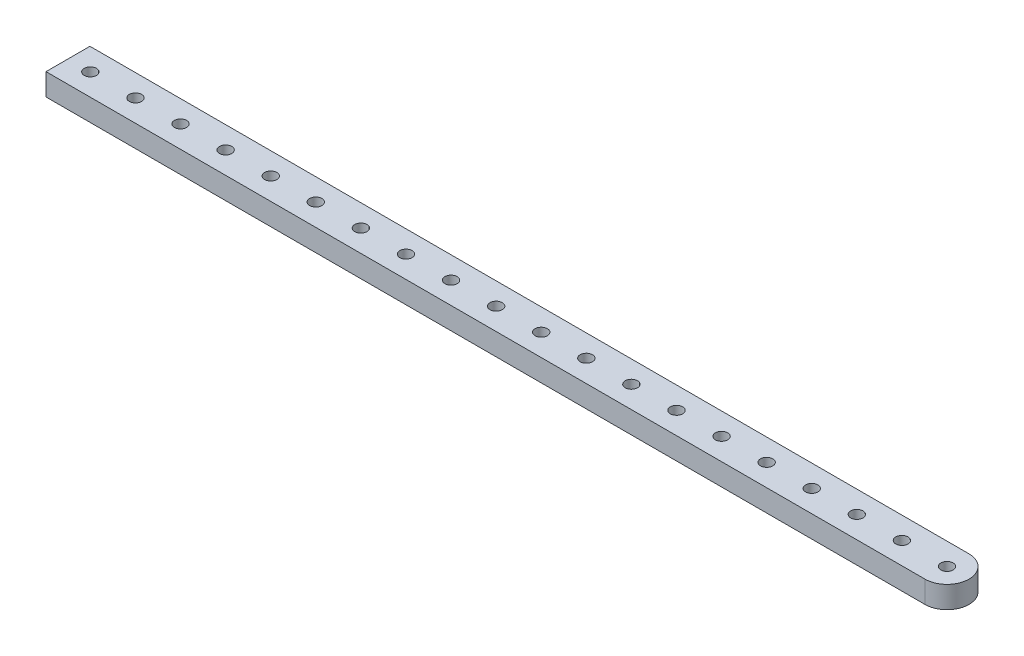
ISO-10303-21;
HEADER;
FILE_DESCRIPTION(('STEP AP214'),'2;1');
FILE_NAME('part.step','',(''),(''),'','','');
FILE_SCHEMA(('AUTOMOTIVE_DESIGN { 1 0 10303 214 1 1 1 1 }'));
ENDSEC;
DATA;
#1=APPLICATION_CONTEXT('core data for automotive mechanical design processes');
#2=APPLICATION_PROTOCOL_DEFINITION('international standard','automotive_design',2000,#1);
#3=PRODUCT_CONTEXT('',#1,'mechanical');
#4=PRODUCT('Part','Part','',(#3));
#5=PRODUCT_RELATED_PRODUCT_CATEGORY('part','',(#4));
#6=PRODUCT_DEFINITION_FORMATION('','',#4);
#7=PRODUCT_DEFINITION_CONTEXT('part definition',#1,'design');
#8=PRODUCT_DEFINITION('design','',#6,#7);
#9=PRODUCT_DEFINITION_SHAPE('','',#8);
#10=(LENGTH_UNIT() NAMED_UNIT(*) SI_UNIT(.MILLI.,.METRE.));
#11=(NAMED_UNIT(*) PLANE_ANGLE_UNIT() SI_UNIT($,.RADIAN.));
#12=(NAMED_UNIT(*) SI_UNIT($,.STERADIAN.) SOLID_ANGLE_UNIT());
#13=UNCERTAINTY_MEASURE_WITH_UNIT(LENGTH_MEASURE(1.E-05),#10,'distance_accuracy_value','');
#14=(GEOMETRIC_REPRESENTATION_CONTEXT(3) GLOBAL_UNCERTAINTY_ASSIGNED_CONTEXT((#13)) GLOBAL_UNIT_ASSIGNED_CONTEXT((#10,
#11,#12)) REPRESENTATION_CONTEXT('',''));
#15=CARTESIAN_POINT('',(0.,0.,0.));
#16=DIRECTION('',(0.,0.,1.));
#17=DIRECTION('',(1.,0.,0.));
#18=AXIS2_PLACEMENT_3D('',#15,#16,#17);
#19=CARTESIAN_POINT('',(130.386666666666,0.,0.));
#20=DIRECTION('',(0.,1.,0.));
#21=DIRECTION('',(0.,0.,1.));
#22=AXIS2_PLACEMENT_3D('',#19,#20,#21);
#23=CYLINDRICAL_SURFACE('',#22,6.35);
#24=CARTESIAN_POINT('',(130.386666666666,6.35,0.));
#25=DIRECTION('',(0.,1.,0.));
#26=DIRECTION('',(0.,0.,1.));
#27=AXIS2_PLACEMENT_3D('',#24,#25,#26);
#28=CIRCLE('',#27,6.35);
#29=CARTESIAN_POINT('',(130.386666666666,6.35,6.35000000000001));
#30=VERTEX_POINT('',#29);
#31=CARTESIAN_POINT('',(130.386666666666,6.35,-6.35));
#32=VERTEX_POINT('',#31);
#33=EDGE_CURVE('E80',#30,#32,#28,.T.);
#34=ORIENTED_EDGE('',*,*,#33,.F.);
#35=DIRECTION('',(0.,1.,0.));
#36=VECTOR('',#35,1.);
#37=CARTESIAN_POINT('',(130.386666666666,0.,6.35000000000001));
#38=LINE('',#37,#36);
#39=CARTESIAN_POINT('',(130.386666666666,0.,6.35000000000001));
#40=VERTEX_POINT('',#39);
#41=EDGE_CURVE('E11',#40,#30,#38,.T.);
#42=ORIENTED_EDGE('',*,*,#41,.F.);
#43=CARTESIAN_POINT('',(130.386666666666,0.,0.));
#44=DIRECTION('',(0.,1.,0.));
#45=DIRECTION('',(0.,0.,1.));
#46=AXIS2_PLACEMENT_3D('',#43,#44,#45);
#47=CIRCLE('',#46,6.35);
#48=CARTESIAN_POINT('',(130.386666666666,0.,-6.35));
#49=VERTEX_POINT('',#48);
#50=EDGE_CURVE('E83',#40,#49,#47,.T.);
#51=ORIENTED_EDGE('',*,*,#50,.T.);
#52=DIRECTION('',(0.,1.,0.));
#53=VECTOR('',#52,1.);
#54=CARTESIAN_POINT('',(130.386666666666,0.,-6.35));
#55=LINE('',#54,#53);
#56=EDGE_CURVE('E42',#49,#32,#55,.T.);
#57=ORIENTED_EDGE('',*,*,#56,.T.);
#58=EDGE_LOOP('',(#34,#42,#51,#57));
#59=FACE_BOUND('',#58,.T.);
#60=ADVANCED_FACE('F39',(#59),#23,.T.);
#61=CARTESIAN_POINT('',(-130.386666666666,0.,6.35000000000001));
#62=DIRECTION('',(0.,0.,1.));
#63=DIRECTION('',(1.,0.,0.));
#64=AXIS2_PLACEMENT_3D('',#61,#62,#63);
#65=PLANE('',#64);
#66=DIRECTION('',(0.,1.,0.));
#67=VECTOR('',#66,1.);
#68=CARTESIAN_POINT('',(-123.824616711286,0.,6.35000000000001));
#69=LINE('',#68,#67);
#70=CARTESIAN_POINT('',(-123.824616711286,0.,6.35000000000003));
#71=VERTEX_POINT('',#70);
#72=CARTESIAN_POINT('',(-123.824616711286,6.35,6.35000000000001));
#73=VERTEX_POINT('',#72);
#74=EDGE_CURVE('E54',#71,#73,#69,.T.);
#75=ORIENTED_EDGE('',*,*,#74,.F.);
#76=DIRECTION('',(1.,0.,0.));
#77=VECTOR('',#76,1.);
#78=CARTESIAN_POINT('',(-130.386666666666,0.,6.35000000000001));
#79=LINE('',#78,#77);
#80=EDGE_CURVE('E61',#71,#40,#79,.T.);
#81=ORIENTED_EDGE('',*,*,#80,.T.);
#82=ORIENTED_EDGE('',*,*,#41,.T.);
#83=DIRECTION('',(1.,0.,0.));
#84=VECTOR('',#83,1.);
#85=CARTESIAN_POINT('',(-130.386666666666,6.35,6.35000000000001));
#86=LINE('',#85,#84);
#87=EDGE_CURVE('E75',#73,#30,#86,.T.);
#88=ORIENTED_EDGE('',*,*,#87,.F.);
#89=EDGE_LOOP('',(#75,#81,#82,#88));
#90=FACE_BOUND('',#89,.T.);
#91=ADVANCED_FACE('F86',(#90),#65,.T.);
#92=CARTESIAN_POINT('',(130.386666666666,0.,-6.35));
#93=DIRECTION('',(0.,0.,-1.));
#94=DIRECTION('',(-1.,0.,0.));
#95=AXIS2_PLACEMENT_3D('',#92,#93,#94);
#96=PLANE('',#95);
#97=DIRECTION('',(0.,-1.,0.));
#98=VECTOR('',#97,1.);
#99=CARTESIAN_POINT('',(-123.824616711286,0.,-6.34999999999999));
#100=LINE('',#99,#98);
#101=CARTESIAN_POINT('',(-123.824616711286,6.35,-6.35));
#102=VERTEX_POINT('',#101);
#103=CARTESIAN_POINT('',(-123.824616711286,0.,-6.35));
#104=VERTEX_POINT('',#103);
#105=EDGE_CURVE('E266',#102,#104,#100,.T.);
#106=ORIENTED_EDGE('',*,*,#105,.F.);
#107=DIRECTION('',(-1.,0.,0.));
#108=VECTOR('',#107,1.);
#109=CARTESIAN_POINT('',(130.386666666666,6.35,-6.35));
#110=LINE('',#109,#108);
#111=EDGE_CURVE('E84',#32,#102,#110,.T.);
#112=ORIENTED_EDGE('',*,*,#111,.F.);
#113=ORIENTED_EDGE('',*,*,#56,.F.);
#114=DIRECTION('',(-1.,0.,0.));
#115=VECTOR('',#114,1.);
#116=CARTESIAN_POINT('',(130.386666666666,0.,-6.35));
#117=LINE('',#116,#115);
#118=EDGE_CURVE('E103',#49,#104,#117,.T.);
#119=ORIENTED_EDGE('',*,*,#118,.T.);
#120=EDGE_LOOP('',(#106,#112,#113,#119));
#121=FACE_BOUND('',#120,.T.);
#122=ADVANCED_FACE('F281',(#121),#96,.T.);
#123=CARTESIAN_POINT('',(130.386666666666,0.,0.));
#124=DIRECTION('',(0.,1.,0.));
#125=DIRECTION('',(0.,0.,1.));
#126=AXIS2_PLACEMENT_3D('',#123,#124,#125);
#127=PLANE('',#126);
#128=CARTESIAN_POINT('',(-117.348,0.,0.));
#129=DIRECTION('',(0.,1.,0.));
#130=DIRECTION('',(0.,0.,-1.));
#131=AXIS2_PLACEMENT_3D('',#128,#129,#130);
#132=CIRCLE('',#131,1.77800000000001);
#133=CARTESIAN_POINT('',(-117.348,0.,-1.77800000000001));
#134=VERTEX_POINT('',#133);
#135=EDGE_CURVE('E253',#134,#134,#132,.T.);
#136=ORIENTED_EDGE('',*,*,#135,.T.);
#137=EDGE_LOOP('',(#136));
#138=FACE_BOUND('',#137,.T.);
#139=CARTESIAN_POINT('',(-104.309333333333,0.,0.));
#140=DIRECTION('',(0.,1.,0.));
#141=DIRECTION('',(0.,0.,-1.));
#142=AXIS2_PLACEMENT_3D('',#139,#140,#141);
#143=CIRCLE('',#142,1.77800000000001);
#144=CARTESIAN_POINT('',(-104.309333333333,0.,-1.778));
#145=VERTEX_POINT('',#144);
#146=EDGE_CURVE('E245',#145,#145,#143,.T.);
#147=ORIENTED_EDGE('',*,*,#146,.T.);
#148=EDGE_LOOP('',(#147));
#149=FACE_BOUND('',#148,.T.);
#150=CARTESIAN_POINT('',(-91.2706666666663,0.,0.));
#151=DIRECTION('',(0.,1.,0.));
#152=DIRECTION('',(0.,0.,-1.));
#153=AXIS2_PLACEMENT_3D('',#150,#151,#152);
#154=CIRCLE('',#153,1.77800000000001);
#155=CARTESIAN_POINT('',(-91.2706666666663,0.,-1.778));
#156=VERTEX_POINT('',#155);
#157=EDGE_CURVE('E237',#156,#156,#154,.T.);
#158=ORIENTED_EDGE('',*,*,#157,.T.);
#159=EDGE_LOOP('',(#158));
#160=FACE_BOUND('',#159,.T.);
#161=CARTESIAN_POINT('',(-78.2319999999997,0.,0.));
#162=DIRECTION('',(0.,1.,0.));
#163=DIRECTION('',(0.,0.,-1.));
#164=AXIS2_PLACEMENT_3D('',#161,#162,#163);
#165=CIRCLE('',#164,1.77800000000001);
#166=CARTESIAN_POINT('',(-78.2319999999997,0.,-1.778));
#167=VERTEX_POINT('',#166);
#168=EDGE_CURVE('E229',#167,#167,#165,.T.);
#169=ORIENTED_EDGE('',*,*,#168,.T.);
#170=EDGE_LOOP('',(#169));
#171=FACE_BOUND('',#170,.T.);
#172=CARTESIAN_POINT('',(-65.193333333333,0.,0.));
#173=DIRECTION('',(0.,1.,0.));
#174=DIRECTION('',(0.,0.,-1.));
#175=AXIS2_PLACEMENT_3D('',#172,#173,#174);
#176=CIRCLE('',#175,1.77800000000001);
#177=CARTESIAN_POINT('',(-65.193333333333,0.,-1.778));
#178=VERTEX_POINT('',#177);
#179=EDGE_CURVE('E221',#178,#178,#176,.T.);
#180=ORIENTED_EDGE('',*,*,#179,.T.);
#181=EDGE_LOOP('',(#180));
#182=FACE_BOUND('',#181,.T.);
#183=CARTESIAN_POINT('',(-52.1546666666665,0.,0.));
#184=DIRECTION('',(0.,1.,0.));
#185=DIRECTION('',(0.,0.,-1.));
#186=AXIS2_PLACEMENT_3D('',#183,#184,#185);
#187=CIRCLE('',#186,1.778);
#188=CARTESIAN_POINT('',(-52.1546666666665,0.,-1.77799999999999));
#189=VERTEX_POINT('',#188);
#190=EDGE_CURVE('E213',#189,#189,#187,.T.);
#191=ORIENTED_EDGE('',*,*,#190,.T.);
#192=EDGE_LOOP('',(#191));
#193=FACE_BOUND('',#192,.T.);
#194=CARTESIAN_POINT('',(-39.1159999999998,0.,0.));
#195=DIRECTION('',(0.,1.,0.));
#196=DIRECTION('',(0.,0.,-1.));
#197=AXIS2_PLACEMENT_3D('',#194,#195,#196);
#198=CIRCLE('',#197,1.778);
#199=CARTESIAN_POINT('',(-39.1159999999998,0.,-1.77799999999999));
#200=VERTEX_POINT('',#199);
#201=EDGE_CURVE('E205',#200,#200,#198,.T.);
#202=ORIENTED_EDGE('',*,*,#201,.T.);
#203=EDGE_LOOP('',(#202));
#204=FACE_BOUND('',#203,.T.);
#205=CARTESIAN_POINT('',(-26.0773333333332,0.,0.));
#206=DIRECTION('',(0.,1.,0.));
#207=DIRECTION('',(0.,0.,-1.));
#208=AXIS2_PLACEMENT_3D('',#205,#206,#207);
#209=CIRCLE('',#208,1.778);
#210=CARTESIAN_POINT('',(-26.0773333333332,0.,-1.77799999999999));
#211=VERTEX_POINT('',#210);
#212=EDGE_CURVE('E197',#211,#211,#209,.T.);
#213=ORIENTED_EDGE('',*,*,#212,.T.);
#214=EDGE_LOOP('',(#213));
#215=FACE_BOUND('',#214,.T.);
#216=CARTESIAN_POINT('',(-13.0386666666666,0.,0.));
#217=DIRECTION('',(0.,1.,0.));
#218=DIRECTION('',(0.,0.,-1.));
#219=AXIS2_PLACEMENT_3D('',#216,#217,#218);
#220=CIRCLE('',#219,1.778);
#221=CARTESIAN_POINT('',(-13.0386666666666,0.,-1.77799999999999));
#222=VERTEX_POINT('',#221);
#223=EDGE_CURVE('E189',#222,#222,#220,.T.);
#224=ORIENTED_EDGE('',*,*,#223,.T.);
#225=EDGE_LOOP('',(#224));
#226=FACE_BOUND('',#225,.T.);
#227=CARTESIAN_POINT('',(0.,0.,0.));
#228=DIRECTION('',(0.,1.,0.));
#229=DIRECTION('',(0.,0.,-1.));
#230=AXIS2_PLACEMENT_3D('',#227,#228,#229);
#231=CIRCLE('',#230,1.778);
#232=CARTESIAN_POINT('',(0.,0.,-1.77799999999999));
#233=VERTEX_POINT('',#232);
#234=EDGE_CURVE('E181',#233,#233,#231,.T.);
#235=ORIENTED_EDGE('',*,*,#234,.T.);
#236=EDGE_LOOP('',(#235));
#237=FACE_BOUND('',#236,.T.);
#238=CARTESIAN_POINT('',(13.0386666666666,0.,0.));
#239=DIRECTION('',(0.,1.,0.));
#240=DIRECTION('',(0.,0.,-1.));
#241=AXIS2_PLACEMENT_3D('',#238,#239,#240);
#242=CIRCLE('',#241,1.778);
#243=CARTESIAN_POINT('',(13.0386666666666,0.,-1.77799999999999));
#244=VERTEX_POINT('',#243);
#245=EDGE_CURVE('E173',#244,#244,#242,.T.);
#246=ORIENTED_EDGE('',*,*,#245,.T.);
#247=EDGE_LOOP('',(#246));
#248=FACE_BOUND('',#247,.T.);
#249=CARTESIAN_POINT('',(26.0773333333332,0.,0.));
#250=DIRECTION('',(0.,1.,0.));
#251=DIRECTION('',(0.,0.,-1.));
#252=AXIS2_PLACEMENT_3D('',#249,#250,#251);
#253=CIRCLE('',#252,1.778);
#254=CARTESIAN_POINT('',(26.0773333333332,0.,-1.77799999999999));
#255=VERTEX_POINT('',#254);
#256=EDGE_CURVE('E165',#255,#255,#253,.T.);
#257=ORIENTED_EDGE('',*,*,#256,.T.);
#258=EDGE_LOOP('',(#257));
#259=FACE_BOUND('',#258,.T.);
#260=CARTESIAN_POINT('',(39.1159999999998,0.,0.));
#261=DIRECTION('',(0.,1.,0.));
#262=DIRECTION('',(0.,0.,-1.));
#263=AXIS2_PLACEMENT_3D('',#260,#261,#262);
#264=CIRCLE('',#263,1.778);
#265=CARTESIAN_POINT('',(39.1159999999998,0.,-1.77799999999998));
#266=VERTEX_POINT('',#265);
#267=EDGE_CURVE('E157',#266,#266,#264,.T.);
#268=ORIENTED_EDGE('',*,*,#267,.T.);
#269=EDGE_LOOP('',(#268));
#270=FACE_BOUND('',#269,.T.);
#271=CARTESIAN_POINT('',(52.1546666666664,0.,0.));
#272=DIRECTION('',(0.,1.,0.));
#273=DIRECTION('',(0.,0.,-1.));
#274=AXIS2_PLACEMENT_3D('',#271,#272,#273);
#275=CIRCLE('',#274,1.778);
#276=CARTESIAN_POINT('',(52.1546666666664,0.,-1.77799999999998));
#277=VERTEX_POINT('',#276);
#278=EDGE_CURVE('E149',#277,#277,#275,.T.);
#279=ORIENTED_EDGE('',*,*,#278,.T.);
#280=EDGE_LOOP('',(#279));
#281=FACE_BOUND('',#280,.T.);
#282=CARTESIAN_POINT('',(65.193333333333,0.,0.));
#283=DIRECTION('',(0.,1.,0.));
#284=DIRECTION('',(0.,0.,-1.));
#285=AXIS2_PLACEMENT_3D('',#282,#283,#284);
#286=CIRCLE('',#285,1.77800000000001);
#287=CARTESIAN_POINT('',(65.193333333333,0.,-1.77799999999999));
#288=VERTEX_POINT('',#287);
#289=EDGE_CURVE('E141',#288,#288,#286,.T.);
#290=ORIENTED_EDGE('',*,*,#289,.T.);
#291=EDGE_LOOP('',(#290));
#292=FACE_BOUND('',#291,.T.);
#293=CARTESIAN_POINT('',(78.2319999999997,0.,0.));
#294=DIRECTION('',(0.,1.,0.));
#295=DIRECTION('',(0.,0.,-1.));
#296=AXIS2_PLACEMENT_3D('',#293,#294,#295);
#297=CIRCLE('',#296,1.77800000000001);
#298=CARTESIAN_POINT('',(78.2319999999997,0.,-1.77799999999999));
#299=VERTEX_POINT('',#298);
#300=EDGE_CURVE('E133',#299,#299,#297,.T.);
#301=ORIENTED_EDGE('',*,*,#300,.T.);
#302=EDGE_LOOP('',(#301));
#303=FACE_BOUND('',#302,.T.);
#304=CARTESIAN_POINT('',(91.2706666666663,0.,0.));
#305=DIRECTION('',(0.,1.,0.));
#306=DIRECTION('',(0.,0.,-1.));
#307=AXIS2_PLACEMENT_3D('',#304,#305,#306);
#308=CIRCLE('',#307,1.77800000000001);
#309=CARTESIAN_POINT('',(91.2706666666663,0.,-1.77799999999999));
#310=VERTEX_POINT('',#309);
#311=EDGE_CURVE('E125',#310,#310,#308,.T.);
#312=ORIENTED_EDGE('',*,*,#311,.T.);
#313=EDGE_LOOP('',(#312));
#314=FACE_BOUND('',#313,.T.);
#315=CARTESIAN_POINT('',(104.309333333333,0.,0.));
#316=DIRECTION('',(0.,1.,0.));
#317=DIRECTION('',(0.,0.,-1.));
#318=AXIS2_PLACEMENT_3D('',#315,#316,#317);
#319=CIRCLE('',#318,1.77800000000001);
#320=CARTESIAN_POINT('',(104.309333333333,0.,-1.77799999999998));
#321=VERTEX_POINT('',#320);
#322=EDGE_CURVE('E117',#321,#321,#319,.T.);
#323=ORIENTED_EDGE('',*,*,#322,.T.);
#324=EDGE_LOOP('',(#323));
#325=FACE_BOUND('',#324,.T.);
#326=CARTESIAN_POINT('',(117.347999999999,0.,0.));
#327=DIRECTION('',(0.,1.,0.));
#328=DIRECTION('',(0.,0.,-1.));
#329=AXIS2_PLACEMENT_3D('',#326,#327,#328);
#330=CIRCLE('',#329,1.77800000000001);
#331=CARTESIAN_POINT('',(117.347999999999,0.,-1.77799999999998));
#332=VERTEX_POINT('',#331);
#333=EDGE_CURVE('E111',#332,#332,#330,.T.);
#334=ORIENTED_EDGE('',*,*,#333,.T.);
#335=EDGE_LOOP('',(#334));
#336=FACE_BOUND('',#335,.T.);
#337=CARTESIAN_POINT('',(130.386666666666,0.,0.));
#338=DIRECTION('',(0.,1.,0.));
#339=DIRECTION('',(0.,0.,-1.));
#340=AXIS2_PLACEMENT_3D('',#337,#338,#339);
#341=CIRCLE('',#340,1.77800000000001);
#342=CARTESIAN_POINT('',(130.386666666666,0.,-1.77799999999998));
#343=VERTEX_POINT('',#342);
#344=EDGE_CURVE('E92',#343,#343,#341,.T.);
#345=ORIENTED_EDGE('',*,*,#344,.T.);
#346=EDGE_LOOP('',(#345));
#347=FACE_BOUND('',#346,.T.);
#348=ORIENTED_EDGE('',*,*,#80,.F.);
#349=DIRECTION('',(0.,0.,-1.));
#350=VECTOR('',#349,1.);
#351=CARTESIAN_POINT('',(-123.824616711286,0.,0.));
#352=LINE('',#351,#350);
#353=EDGE_CURVE('E270',#71,#104,#352,.T.);
#354=ORIENTED_EDGE('',*,*,#353,.T.);
#355=ORIENTED_EDGE('',*,*,#118,.F.);
#356=ORIENTED_EDGE('',*,*,#50,.F.);
#357=EDGE_LOOP('',(#348,#354,#355,#356));
#358=FACE_BOUND('',#357,.T.);
#359=ADVANCED_FACE('F284',(#138,#149,#160,#171,#182,#193,#204,#215,#226,#237,#248,#259,#270,
#281,#292,#303,#314,#325,#336,#347,#358),#127,.F.);
#360=CARTESIAN_POINT('',(130.386666666666,6.35,0.));
#361=DIRECTION('',(0.,1.,0.));
#362=DIRECTION('',(0.,0.,1.));
#363=AXIS2_PLACEMENT_3D('',#360,#361,#362);
#364=PLANE('',#363);
#365=DIRECTION('',(0.,0.,-1.));
#366=VECTOR('',#365,1.);
#367=CARTESIAN_POINT('',(-123.824616711286,6.35,-6.91453421693578));
#368=LINE('',#367,#366);
#369=EDGE_CURVE('E81',#73,#102,#368,.T.);
#370=ORIENTED_EDGE('',*,*,#369,.F.);
#371=ORIENTED_EDGE('',*,*,#87,.T.);
#372=ORIENTED_EDGE('',*,*,#33,.T.);
#373=ORIENTED_EDGE('',*,*,#111,.T.);
#374=EDGE_LOOP('',(#370,#371,#372,#373));
#375=FACE_BOUND('',#374,.T.);
#376=CARTESIAN_POINT('',(-117.348,6.35,0.));
#377=DIRECTION('',(0.,1.,0.));
#378=DIRECTION('',(0.,0.,-1.));
#379=AXIS2_PLACEMENT_3D('',#376,#377,#378);
#380=CIRCLE('',#379,1.77800000000001);
#381=CARTESIAN_POINT('',(-117.348,6.35,-1.77800000000001));
#382=VERTEX_POINT('',#381);
#383=EDGE_CURVE('E257',#382,#382,#380,.T.);
#384=ORIENTED_EDGE('',*,*,#383,.F.);
#385=EDGE_LOOP('',(#384));
#386=FACE_BOUND('',#385,.T.);
#387=CARTESIAN_POINT('',(-104.309333333333,6.35,0.));
#388=DIRECTION('',(0.,1.,0.));
#389=DIRECTION('',(0.,0.,-1.));
#390=AXIS2_PLACEMENT_3D('',#387,#388,#389);
#391=CIRCLE('',#390,1.77800000000001);
#392=CARTESIAN_POINT('',(-104.309333333333,6.35,-1.778));
#393=VERTEX_POINT('',#392);
#394=EDGE_CURVE('E249',#393,#393,#391,.T.);
#395=ORIENTED_EDGE('',*,*,#394,.F.);
#396=EDGE_LOOP('',(#395));
#397=FACE_BOUND('',#396,.T.);
#398=CARTESIAN_POINT('',(-91.2706666666663,6.35,0.));
#399=DIRECTION('',(0.,1.,0.));
#400=DIRECTION('',(0.,0.,-1.));
#401=AXIS2_PLACEMENT_3D('',#398,#399,#400);
#402=CIRCLE('',#401,1.77800000000001);
#403=CARTESIAN_POINT('',(-91.2706666666663,6.35,-1.778));
#404=VERTEX_POINT('',#403);
#405=EDGE_CURVE('E241',#404,#404,#402,.T.);
#406=ORIENTED_EDGE('',*,*,#405,.F.);
#407=EDGE_LOOP('',(#406));
#408=FACE_BOUND('',#407,.T.);
#409=CARTESIAN_POINT('',(-78.2319999999997,6.35,0.));
#410=DIRECTION('',(0.,1.,0.));
#411=DIRECTION('',(0.,0.,-1.));
#412=AXIS2_PLACEMENT_3D('',#409,#410,#411);
#413=CIRCLE('',#412,1.77800000000001);
#414=CARTESIAN_POINT('',(-78.2319999999997,6.35,-1.778));
#415=VERTEX_POINT('',#414);
#416=EDGE_CURVE('E233',#415,#415,#413,.T.);
#417=ORIENTED_EDGE('',*,*,#416,.F.);
#418=EDGE_LOOP('',(#417));
#419=FACE_BOUND('',#418,.T.);
#420=CARTESIAN_POINT('',(-65.193333333333,6.35,0.));
#421=DIRECTION('',(0.,1.,0.));
#422=DIRECTION('',(0.,0.,-1.));
#423=AXIS2_PLACEMENT_3D('',#420,#421,#422);
#424=CIRCLE('',#423,1.77800000000001);
#425=CARTESIAN_POINT('',(-65.193333333333,6.35,-1.778));
#426=VERTEX_POINT('',#425);
#427=EDGE_CURVE('E225',#426,#426,#424,.T.);
#428=ORIENTED_EDGE('',*,*,#427,.F.);
#429=EDGE_LOOP('',(#428));
#430=FACE_BOUND('',#429,.T.);
#431=CARTESIAN_POINT('',(-52.1546666666665,6.35,0.));
#432=DIRECTION('',(0.,1.,0.));
#433=DIRECTION('',(0.,0.,-1.));
#434=AXIS2_PLACEMENT_3D('',#431,#432,#433);
#435=CIRCLE('',#434,1.778);
#436=CARTESIAN_POINT('',(-52.1546666666665,6.35,-1.77799999999999));
#437=VERTEX_POINT('',#436);
#438=EDGE_CURVE('E217',#437,#437,#435,.T.);
#439=ORIENTED_EDGE('',*,*,#438,.F.);
#440=EDGE_LOOP('',(#439));
#441=FACE_BOUND('',#440,.T.);
#442=CARTESIAN_POINT('',(-39.1159999999998,6.35,0.));
#443=DIRECTION('',(0.,1.,0.));
#444=DIRECTION('',(0.,0.,-1.));
#445=AXIS2_PLACEMENT_3D('',#442,#443,#444);
#446=CIRCLE('',#445,1.778);
#447=CARTESIAN_POINT('',(-39.1159999999998,6.35,-1.77799999999999));
#448=VERTEX_POINT('',#447);
#449=EDGE_CURVE('E209',#448,#448,#446,.T.);
#450=ORIENTED_EDGE('',*,*,#449,.F.);
#451=EDGE_LOOP('',(#450));
#452=FACE_BOUND('',#451,.T.);
#453=CARTESIAN_POINT('',(-26.0773333333332,6.35,0.));
#454=DIRECTION('',(0.,1.,0.));
#455=DIRECTION('',(0.,0.,-1.));
#456=AXIS2_PLACEMENT_3D('',#453,#454,#455);
#457=CIRCLE('',#456,1.778);
#458=CARTESIAN_POINT('',(-26.0773333333332,6.35,-1.77799999999999));
#459=VERTEX_POINT('',#458);
#460=EDGE_CURVE('E201',#459,#459,#457,.T.);
#461=ORIENTED_EDGE('',*,*,#460,.F.);
#462=EDGE_LOOP('',(#461));
#463=FACE_BOUND('',#462,.T.);
#464=CARTESIAN_POINT('',(-13.0386666666666,6.35,0.));
#465=DIRECTION('',(0.,1.,0.));
#466=DIRECTION('',(0.,0.,-1.));
#467=AXIS2_PLACEMENT_3D('',#464,#465,#466);
#468=CIRCLE('',#467,1.778);
#469=CARTESIAN_POINT('',(-13.0386666666666,6.35,-1.77799999999999));
#470=VERTEX_POINT('',#469);
#471=EDGE_CURVE('E193',#470,#470,#468,.T.);
#472=ORIENTED_EDGE('',*,*,#471,.F.);
#473=EDGE_LOOP('',(#472));
#474=FACE_BOUND('',#473,.T.);
#475=CARTESIAN_POINT('',(0.,6.35,0.));
#476=DIRECTION('',(0.,1.,0.));
#477=DIRECTION('',(0.,0.,-1.));
#478=AXIS2_PLACEMENT_3D('',#475,#476,#477);
#479=CIRCLE('',#478,1.778);
#480=CARTESIAN_POINT('',(0.,6.35,-1.77799999999999));
#481=VERTEX_POINT('',#480);
#482=EDGE_CURVE('E185',#481,#481,#479,.T.);
#483=ORIENTED_EDGE('',*,*,#482,.F.);
#484=EDGE_LOOP('',(#483));
#485=FACE_BOUND('',#484,.T.);
#486=CARTESIAN_POINT('',(13.0386666666666,6.35,0.));
#487=DIRECTION('',(0.,1.,0.));
#488=DIRECTION('',(0.,0.,-1.));
#489=AXIS2_PLACEMENT_3D('',#486,#487,#488);
#490=CIRCLE('',#489,1.778);
#491=CARTESIAN_POINT('',(13.0386666666666,6.35,-1.77799999999999));
#492=VERTEX_POINT('',#491);
#493=EDGE_CURVE('E177',#492,#492,#490,.T.);
#494=ORIENTED_EDGE('',*,*,#493,.F.);
#495=EDGE_LOOP('',(#494));
#496=FACE_BOUND('',#495,.T.);
#497=CARTESIAN_POINT('',(26.0773333333332,6.35,0.));
#498=DIRECTION('',(0.,1.,0.));
#499=DIRECTION('',(0.,0.,-1.));
#500=AXIS2_PLACEMENT_3D('',#497,#498,#499);
#501=CIRCLE('',#500,1.778);
#502=CARTESIAN_POINT('',(26.0773333333332,6.35,-1.77799999999999));
#503=VERTEX_POINT('',#502);
#504=EDGE_CURVE('E169',#503,#503,#501,.T.);
#505=ORIENTED_EDGE('',*,*,#504,.F.);
#506=EDGE_LOOP('',(#505));
#507=FACE_BOUND('',#506,.T.);
#508=CARTESIAN_POINT('',(39.1159999999998,6.35,0.));
#509=DIRECTION('',(0.,1.,0.));
#510=DIRECTION('',(0.,0.,-1.));
#511=AXIS2_PLACEMENT_3D('',#508,#509,#510);
#512=CIRCLE('',#511,1.778);
#513=CARTESIAN_POINT('',(39.1159999999998,6.35,-1.77799999999998));
#514=VERTEX_POINT('',#513);
#515=EDGE_CURVE('E161',#514,#514,#512,.T.);
#516=ORIENTED_EDGE('',*,*,#515,.F.);
#517=EDGE_LOOP('',(#516));
#518=FACE_BOUND('',#517,.T.);
#519=CARTESIAN_POINT('',(52.1546666666664,6.35,0.));
#520=DIRECTION('',(0.,1.,0.));
#521=DIRECTION('',(0.,0.,-1.));
#522=AXIS2_PLACEMENT_3D('',#519,#520,#521);
#523=CIRCLE('',#522,1.778);
#524=CARTESIAN_POINT('',(52.1546666666664,6.35,-1.77799999999998));
#525=VERTEX_POINT('',#524);
#526=EDGE_CURVE('E153',#525,#525,#523,.T.);
#527=ORIENTED_EDGE('',*,*,#526,.F.);
#528=EDGE_LOOP('',(#527));
#529=FACE_BOUND('',#528,.T.);
#530=CARTESIAN_POINT('',(65.193333333333,6.35,0.));
#531=DIRECTION('',(0.,1.,0.));
#532=DIRECTION('',(0.,0.,-1.));
#533=AXIS2_PLACEMENT_3D('',#530,#531,#532);
#534=CIRCLE('',#533,1.77800000000001);
#535=CARTESIAN_POINT('',(65.193333333333,6.35,-1.77799999999999));
#536=VERTEX_POINT('',#535);
#537=EDGE_CURVE('E145',#536,#536,#534,.T.);
#538=ORIENTED_EDGE('',*,*,#537,.F.);
#539=EDGE_LOOP('',(#538));
#540=FACE_BOUND('',#539,.T.);
#541=CARTESIAN_POINT('',(78.2319999999997,6.35,0.));
#542=DIRECTION('',(0.,1.,0.));
#543=DIRECTION('',(0.,0.,-1.));
#544=AXIS2_PLACEMENT_3D('',#541,#542,#543);
#545=CIRCLE('',#544,1.77800000000001);
#546=CARTESIAN_POINT('',(78.2319999999997,6.35,-1.77799999999999));
#547=VERTEX_POINT('',#546);
#548=EDGE_CURVE('E137',#547,#547,#545,.T.);
#549=ORIENTED_EDGE('',*,*,#548,.F.);
#550=EDGE_LOOP('',(#549));
#551=FACE_BOUND('',#550,.T.);
#552=CARTESIAN_POINT('',(91.2706666666663,6.35,0.));
#553=DIRECTION('',(0.,1.,0.));
#554=DIRECTION('',(0.,0.,-1.));
#555=AXIS2_PLACEMENT_3D('',#552,#553,#554);
#556=CIRCLE('',#555,1.77800000000001);
#557=CARTESIAN_POINT('',(91.2706666666663,6.35,-1.77799999999999));
#558=VERTEX_POINT('',#557);
#559=EDGE_CURVE('E129',#558,#558,#556,.T.);
#560=ORIENTED_EDGE('',*,*,#559,.F.);
#561=EDGE_LOOP('',(#560));
#562=FACE_BOUND('',#561,.T.);
#563=CARTESIAN_POINT('',(104.309333333333,6.35,0.));
#564=DIRECTION('',(0.,1.,0.));
#565=DIRECTION('',(0.,0.,-1.));
#566=AXIS2_PLACEMENT_3D('',#563,#564,#565);
#567=CIRCLE('',#566,1.77800000000001);
#568=CARTESIAN_POINT('',(104.309333333333,6.35,-1.77799999999998));
#569=VERTEX_POINT('',#568);
#570=EDGE_CURVE('E121',#569,#569,#567,.T.);
#571=ORIENTED_EDGE('',*,*,#570,.F.);
#572=EDGE_LOOP('',(#571));
#573=FACE_BOUND('',#572,.T.);
#574=CARTESIAN_POINT('',(117.347999999999,6.35,0.));
#575=DIRECTION('',(0.,1.,0.));
#576=DIRECTION('',(0.,0.,-1.));
#577=AXIS2_PLACEMENT_3D('',#574,#575,#576);
#578=CIRCLE('',#577,1.77800000000001);
#579=CARTESIAN_POINT('',(117.347999999999,6.35,-1.77799999999998));
#580=VERTEX_POINT('',#579);
#581=EDGE_CURVE('E113',#580,#580,#578,.T.);
#582=ORIENTED_EDGE('',*,*,#581,.F.);
#583=EDGE_LOOP('',(#582));
#584=FACE_BOUND('',#583,.T.);
#585=CARTESIAN_POINT('',(130.386666666666,6.35,0.));
#586=DIRECTION('',(0.,1.,0.));
#587=DIRECTION('',(0.,0.,-1.));
#588=AXIS2_PLACEMENT_3D('',#585,#586,#587);
#589=CIRCLE('',#588,1.77800000000001);
#590=CARTESIAN_POINT('',(130.386666666666,6.35,-1.77799999999998));
#591=VERTEX_POINT('',#590);
#592=EDGE_CURVE('E98',#591,#591,#589,.T.);
#593=ORIENTED_EDGE('',*,*,#592,.F.);
#594=EDGE_LOOP('',(#593));
#595=FACE_BOUND('',#594,.T.);
#596=ADVANCED_FACE('F76',(#375,#386,#397,#408,#419,#430,#441,#452,#463,#474,#485,#496,#507,#518,
#529,#540,#551,#562,#573,#584,#595),#364,.T.);
#597=CARTESIAN_POINT('',(130.386666666666,0.,0.));
#598=DIRECTION('',(0.,1.,0.));
#599=DIRECTION('',(0.,0.,1.));
#600=AXIS2_PLACEMENT_3D('',#597,#598,#599);
#601=CYLINDRICAL_SURFACE('',#600,1.77800000000001);
#602=ORIENTED_EDGE('',*,*,#344,.F.);
#603=EDGE_LOOP('',(#602));
#604=FACE_BOUND('',#603,.T.);
#605=ORIENTED_EDGE('',*,*,#592,.T.);
#606=EDGE_LOOP('',(#605));
#607=FACE_BOUND('',#606,.T.);
#608=ADVANCED_FACE('F293',(#604,#607),#601,.F.);
#609=CARTESIAN_POINT('',(117.347999999999,0.,0.));
#610=DIRECTION('',(0.,1.,0.));
#611=DIRECTION('',(0.,0.,1.));
#612=AXIS2_PLACEMENT_3D('',#609,#610,#611);
#613=CYLINDRICAL_SURFACE('',#612,1.77800000000001);
#614=ORIENTED_EDGE('',*,*,#333,.F.);
#615=EDGE_LOOP('',(#614));
#616=FACE_BOUND('',#615,.T.);
#617=ORIENTED_EDGE('',*,*,#581,.T.);
#618=EDGE_LOOP('',(#617));
#619=FACE_BOUND('',#618,.T.);
#620=ADVANCED_FACE('F473',(#616,#619),#613,.F.);
#621=CARTESIAN_POINT('',(104.309333333333,0.,0.));
#622=DIRECTION('',(0.,1.,0.));
#623=DIRECTION('',(0.,0.,1.));
#624=AXIS2_PLACEMENT_3D('',#621,#622,#623);
#625=CYLINDRICAL_SURFACE('',#624,1.77800000000001);
#626=ORIENTED_EDGE('',*,*,#322,.F.);
#627=EDGE_LOOP('',(#626));
#628=FACE_BOUND('',#627,.T.);
#629=ORIENTED_EDGE('',*,*,#570,.T.);
#630=EDGE_LOOP('',(#629));
#631=FACE_BOUND('',#630,.T.);
#632=ADVANCED_FACE('F465',(#628,#631),#625,.F.);
#633=CARTESIAN_POINT('',(91.2706666666663,0.,0.));
#634=DIRECTION('',(0.,1.,0.));
#635=DIRECTION('',(0.,0.,1.));
#636=AXIS2_PLACEMENT_3D('',#633,#634,#635);
#637=CYLINDRICAL_SURFACE('',#636,1.77800000000001);
#638=ORIENTED_EDGE('',*,*,#311,.F.);
#639=EDGE_LOOP('',(#638));
#640=FACE_BOUND('',#639,.T.);
#641=ORIENTED_EDGE('',*,*,#559,.T.);
#642=EDGE_LOOP('',(#641));
#643=FACE_BOUND('',#642,.T.);
#644=ADVANCED_FACE('F457',(#640,#643),#637,.F.);
#645=CARTESIAN_POINT('',(78.2319999999997,0.,0.));
#646=DIRECTION('',(0.,1.,0.));
#647=DIRECTION('',(0.,0.,1.));
#648=AXIS2_PLACEMENT_3D('',#645,#646,#647);
#649=CYLINDRICAL_SURFACE('',#648,1.77800000000001);
#650=ORIENTED_EDGE('',*,*,#300,.F.);
#651=EDGE_LOOP('',(#650));
#652=FACE_BOUND('',#651,.T.);
#653=ORIENTED_EDGE('',*,*,#548,.T.);
#654=EDGE_LOOP('',(#653));
#655=FACE_BOUND('',#654,.T.);
#656=ADVANCED_FACE('F449',(#652,#655),#649,.F.);
#657=CARTESIAN_POINT('',(65.193333333333,0.,0.));
#658=DIRECTION('',(0.,1.,0.));
#659=DIRECTION('',(0.,0.,1.));
#660=AXIS2_PLACEMENT_3D('',#657,#658,#659);
#661=CYLINDRICAL_SURFACE('',#660,1.77800000000001);
#662=ORIENTED_EDGE('',*,*,#289,.F.);
#663=EDGE_LOOP('',(#662));
#664=FACE_BOUND('',#663,.T.);
#665=ORIENTED_EDGE('',*,*,#537,.T.);
#666=EDGE_LOOP('',(#665));
#667=FACE_BOUND('',#666,.T.);
#668=ADVANCED_FACE('F441',(#664,#667),#661,.F.);
#669=CARTESIAN_POINT('',(52.1546666666664,0.,0.));
#670=DIRECTION('',(0.,1.,0.));
#671=DIRECTION('',(0.,0.,1.));
#672=AXIS2_PLACEMENT_3D('',#669,#670,#671);
#673=CYLINDRICAL_SURFACE('',#672,1.778);
#674=ORIENTED_EDGE('',*,*,#278,.F.);
#675=EDGE_LOOP('',(#674));
#676=FACE_BOUND('',#675,.T.);
#677=ORIENTED_EDGE('',*,*,#526,.T.);
#678=EDGE_LOOP('',(#677));
#679=FACE_BOUND('',#678,.T.);
#680=ADVANCED_FACE('F433',(#676,#679),#673,.F.);
#681=CARTESIAN_POINT('',(39.1159999999998,0.,0.));
#682=DIRECTION('',(0.,1.,0.));
#683=DIRECTION('',(0.,0.,1.));
#684=AXIS2_PLACEMENT_3D('',#681,#682,#683);
#685=CYLINDRICAL_SURFACE('',#684,1.778);
#686=ORIENTED_EDGE('',*,*,#267,.F.);
#687=EDGE_LOOP('',(#686));
#688=FACE_BOUND('',#687,.T.);
#689=ORIENTED_EDGE('',*,*,#515,.T.);
#690=EDGE_LOOP('',(#689));
#691=FACE_BOUND('',#690,.T.);
#692=ADVANCED_FACE('F425',(#688,#691),#685,.F.);
#693=CARTESIAN_POINT('',(26.0773333333332,0.,0.));
#694=DIRECTION('',(0.,1.,0.));
#695=DIRECTION('',(0.,0.,1.));
#696=AXIS2_PLACEMENT_3D('',#693,#694,#695);
#697=CYLINDRICAL_SURFACE('',#696,1.778);
#698=ORIENTED_EDGE('',*,*,#256,.F.);
#699=EDGE_LOOP('',(#698));
#700=FACE_BOUND('',#699,.T.);
#701=ORIENTED_EDGE('',*,*,#504,.T.);
#702=EDGE_LOOP('',(#701));
#703=FACE_BOUND('',#702,.T.);
#704=ADVANCED_FACE('F417',(#700,#703),#697,.F.);
#705=CARTESIAN_POINT('',(13.0386666666666,0.,0.));
#706=DIRECTION('',(0.,1.,0.));
#707=DIRECTION('',(0.,0.,1.));
#708=AXIS2_PLACEMENT_3D('',#705,#706,#707);
#709=CYLINDRICAL_SURFACE('',#708,1.778);
#710=ORIENTED_EDGE('',*,*,#245,.F.);
#711=EDGE_LOOP('',(#710));
#712=FACE_BOUND('',#711,.T.);
#713=ORIENTED_EDGE('',*,*,#493,.T.);
#714=EDGE_LOOP('',(#713));
#715=FACE_BOUND('',#714,.T.);
#716=ADVANCED_FACE('F409',(#712,#715),#709,.F.);
#717=CARTESIAN_POINT('',(0.,0.,0.));
#718=DIRECTION('',(0.,1.,0.));
#719=DIRECTION('',(0.,0.,1.));
#720=AXIS2_PLACEMENT_3D('',#717,#718,#719);
#721=CYLINDRICAL_SURFACE('',#720,1.778);
#722=ORIENTED_EDGE('',*,*,#234,.F.);
#723=EDGE_LOOP('',(#722));
#724=FACE_BOUND('',#723,.T.);
#725=ORIENTED_EDGE('',*,*,#482,.T.);
#726=EDGE_LOOP('',(#725));
#727=FACE_BOUND('',#726,.T.);
#728=ADVANCED_FACE('F401',(#724,#727),#721,.F.);
#729=CARTESIAN_POINT('',(-13.0386666666666,0.,0.));
#730=DIRECTION('',(0.,1.,0.));
#731=DIRECTION('',(0.,0.,1.));
#732=AXIS2_PLACEMENT_3D('',#729,#730,#731);
#733=CYLINDRICAL_SURFACE('',#732,1.778);
#734=ORIENTED_EDGE('',*,*,#223,.F.);
#735=EDGE_LOOP('',(#734));
#736=FACE_BOUND('',#735,.T.);
#737=ORIENTED_EDGE('',*,*,#471,.T.);
#738=EDGE_LOOP('',(#737));
#739=FACE_BOUND('',#738,.T.);
#740=ADVANCED_FACE('F393',(#736,#739),#733,.F.);
#741=CARTESIAN_POINT('',(-26.0773333333332,0.,0.));
#742=DIRECTION('',(0.,1.,0.));
#743=DIRECTION('',(0.,0.,1.));
#744=AXIS2_PLACEMENT_3D('',#741,#742,#743);
#745=CYLINDRICAL_SURFACE('',#744,1.778);
#746=ORIENTED_EDGE('',*,*,#212,.F.);
#747=EDGE_LOOP('',(#746));
#748=FACE_BOUND('',#747,.T.);
#749=ORIENTED_EDGE('',*,*,#460,.T.);
#750=EDGE_LOOP('',(#749));
#751=FACE_BOUND('',#750,.T.);
#752=ADVANCED_FACE('F385',(#748,#751),#745,.F.);
#753=CARTESIAN_POINT('',(-39.1159999999998,0.,0.));
#754=DIRECTION('',(0.,1.,0.));
#755=DIRECTION('',(0.,0.,1.));
#756=AXIS2_PLACEMENT_3D('',#753,#754,#755);
#757=CYLINDRICAL_SURFACE('',#756,1.778);
#758=ORIENTED_EDGE('',*,*,#201,.F.);
#759=EDGE_LOOP('',(#758));
#760=FACE_BOUND('',#759,.T.);
#761=ORIENTED_EDGE('',*,*,#449,.T.);
#762=EDGE_LOOP('',(#761));
#763=FACE_BOUND('',#762,.T.);
#764=ADVANCED_FACE('F377',(#760,#763),#757,.F.);
#765=CARTESIAN_POINT('',(-52.1546666666665,0.,0.));
#766=DIRECTION('',(0.,1.,0.));
#767=DIRECTION('',(0.,0.,1.));
#768=AXIS2_PLACEMENT_3D('',#765,#766,#767);
#769=CYLINDRICAL_SURFACE('',#768,1.778);
#770=ORIENTED_EDGE('',*,*,#190,.F.);
#771=EDGE_LOOP('',(#770));
#772=FACE_BOUND('',#771,.T.);
#773=ORIENTED_EDGE('',*,*,#438,.T.);
#774=EDGE_LOOP('',(#773));
#775=FACE_BOUND('',#774,.T.);
#776=ADVANCED_FACE('F369',(#772,#775),#769,.F.);
#777=CARTESIAN_POINT('',(-65.193333333333,0.,0.));
#778=DIRECTION('',(0.,1.,0.));
#779=DIRECTION('',(0.,0.,1.));
#780=AXIS2_PLACEMENT_3D('',#777,#778,#779);
#781=CYLINDRICAL_SURFACE('',#780,1.77800000000001);
#782=ORIENTED_EDGE('',*,*,#179,.F.);
#783=EDGE_LOOP('',(#782));
#784=FACE_BOUND('',#783,.T.);
#785=ORIENTED_EDGE('',*,*,#427,.T.);
#786=EDGE_LOOP('',(#785));
#787=FACE_BOUND('',#786,.T.);
#788=ADVANCED_FACE('F361',(#784,#787),#781,.F.);
#789=CARTESIAN_POINT('',(-78.2319999999997,0.,0.));
#790=DIRECTION('',(0.,1.,0.));
#791=DIRECTION('',(0.,0.,1.));
#792=AXIS2_PLACEMENT_3D('',#789,#790,#791);
#793=CYLINDRICAL_SURFACE('',#792,1.77800000000001);
#794=ORIENTED_EDGE('',*,*,#168,.F.);
#795=EDGE_LOOP('',(#794));
#796=FACE_BOUND('',#795,.T.);
#797=ORIENTED_EDGE('',*,*,#416,.T.);
#798=EDGE_LOOP('',(#797));
#799=FACE_BOUND('',#798,.T.);
#800=ADVANCED_FACE('F353',(#796,#799),#793,.F.);
#801=CARTESIAN_POINT('',(-91.2706666666663,0.,0.));
#802=DIRECTION('',(0.,1.,0.));
#803=DIRECTION('',(0.,0.,1.));
#804=AXIS2_PLACEMENT_3D('',#801,#802,#803);
#805=CYLINDRICAL_SURFACE('',#804,1.77800000000001);
#806=ORIENTED_EDGE('',*,*,#157,.F.);
#807=EDGE_LOOP('',(#806));
#808=FACE_BOUND('',#807,.T.);
#809=ORIENTED_EDGE('',*,*,#405,.T.);
#810=EDGE_LOOP('',(#809));
#811=FACE_BOUND('',#810,.T.);
#812=ADVANCED_FACE('F345',(#808,#811),#805,.F.);
#813=CARTESIAN_POINT('',(-104.309333333333,0.,0.));
#814=DIRECTION('',(0.,1.,0.));
#815=DIRECTION('',(0.,0.,1.));
#816=AXIS2_PLACEMENT_3D('',#813,#814,#815);
#817=CYLINDRICAL_SURFACE('',#816,1.77800000000001);
#818=ORIENTED_EDGE('',*,*,#146,.F.);
#819=EDGE_LOOP('',(#818));
#820=FACE_BOUND('',#819,.T.);
#821=ORIENTED_EDGE('',*,*,#394,.T.);
#822=EDGE_LOOP('',(#821));
#823=FACE_BOUND('',#822,.T.);
#824=ADVANCED_FACE('F338',(#820,#823),#817,.F.);
#825=CARTESIAN_POINT('',(-117.348,0.,0.));
#826=DIRECTION('',(0.,1.,0.));
#827=DIRECTION('',(0.,0.,1.));
#828=AXIS2_PLACEMENT_3D('',#825,#826,#827);
#829=CYLINDRICAL_SURFACE('',#828,1.77800000000001);
#830=ORIENTED_EDGE('',*,*,#135,.F.);
#831=EDGE_LOOP('',(#830));
#832=FACE_BOUND('',#831,.T.);
#833=ORIENTED_EDGE('',*,*,#383,.T.);
#834=EDGE_LOOP('',(#833));
#835=FACE_BOUND('',#834,.T.);
#836=ADVANCED_FACE('F329',(#832,#835),#829,.F.);
#837=CARTESIAN_POINT('',(-123.824616711286,-3.81,-6.91453421693578));
#838=DIRECTION('',(1.,0.,0.));
#839=DIRECTION('',(0.,0.,-1.));
#840=AXIS2_PLACEMENT_3D('',#837,#838,#839);
#841=PLANE('',#840);
#842=ORIENTED_EDGE('',*,*,#74,.T.);
#843=ORIENTED_EDGE('',*,*,#369,.T.);
#844=ORIENTED_EDGE('',*,*,#105,.T.);
#845=ORIENTED_EDGE('',*,*,#353,.F.);
#846=EDGE_LOOP('',(#842,#843,#844,#845));
#847=FACE_BOUND('',#846,.T.);
#848=ADVANCED_FACE('F277',(#847),#841,.F.);
#849=CLOSED_SHELL('',(#60,#91,#122,#359,#596,#608,#620,#632,#644,#656,#668,#680,#692,#704,#716,
#728,#740,#752,#764,#776,#788,#800,#812,#824,#836,#848));
#850=MANIFOLD_SOLID_BREP('B2',#849);
#851=ADVANCED_BREP_SHAPE_REPRESENTATION('',(#18,#850),#14);
#852=SHAPE_DEFINITION_REPRESENTATION(#9,#851);
ENDSEC;
END-ISO-10303-21;
